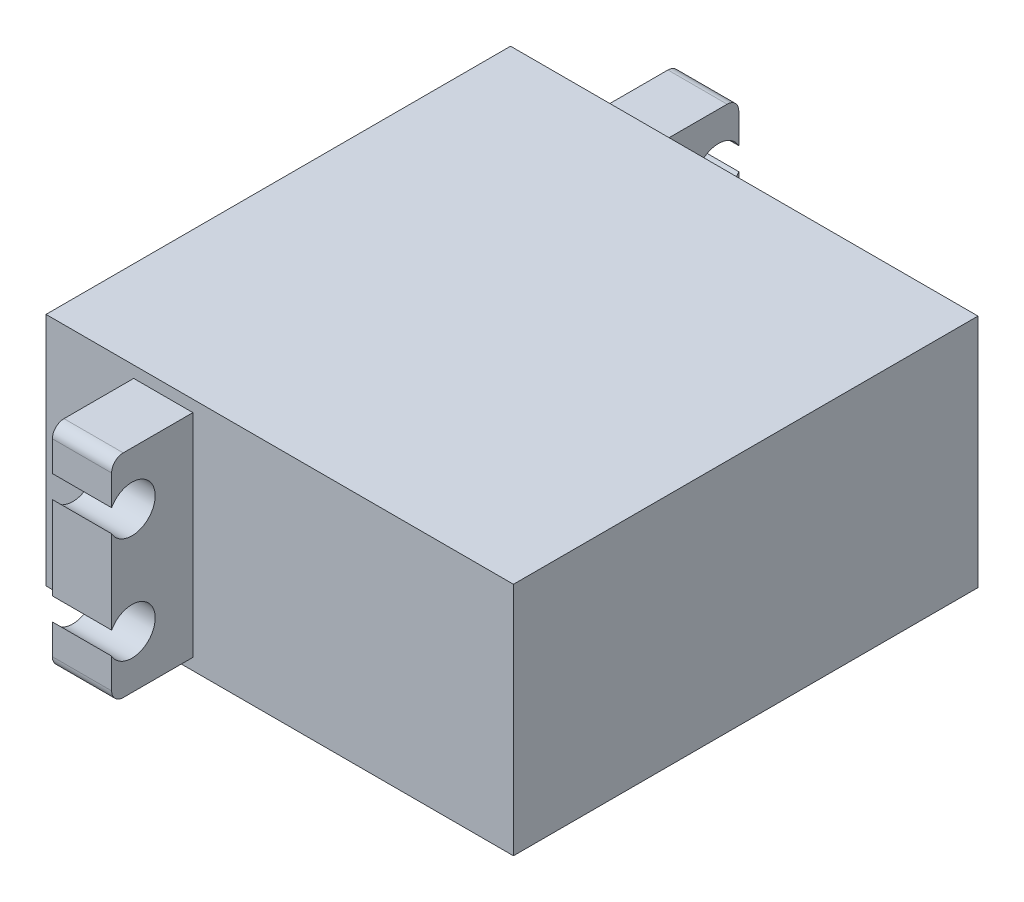
ISO-10303-21;
HEADER;
FILE_DESCRIPTION(('STEP AP214'),'2;1');
FILE_NAME('part.step','',(''),(''),'','','');
FILE_SCHEMA(('AUTOMOTIVE_DESIGN { 1 0 10303 214 1 1 1 1 }'));
ENDSEC;
DATA;
#1=APPLICATION_CONTEXT('core data for automotive mechanical design processes');
#2=APPLICATION_PROTOCOL_DEFINITION('international standard','automotive_design',2000,#1);
#3=PRODUCT_CONTEXT('',#1,'mechanical');
#4=PRODUCT('Part','Part','',(#3));
#5=PRODUCT_RELATED_PRODUCT_CATEGORY('part','',(#4));
#6=PRODUCT_DEFINITION_FORMATION('','',#4);
#7=PRODUCT_DEFINITION_CONTEXT('part definition',#1,'design');
#8=PRODUCT_DEFINITION('design','',#6,#7);
#9=PRODUCT_DEFINITION_SHAPE('','',#8);
#10=(LENGTH_UNIT() NAMED_UNIT(*) SI_UNIT(.MILLI.,.METRE.));
#11=(NAMED_UNIT(*) PLANE_ANGLE_UNIT() SI_UNIT($,.RADIAN.));
#12=(NAMED_UNIT(*) SI_UNIT($,.STERADIAN.) SOLID_ANGLE_UNIT());
#13=UNCERTAINTY_MEASURE_WITH_UNIT(LENGTH_MEASURE(1.E-05),#10,'distance_accuracy_value','');
#14=(GEOMETRIC_REPRESENTATION_CONTEXT(3) GLOBAL_UNCERTAINTY_ASSIGNED_CONTEXT((#13)) GLOBAL_UNIT_ASSIGNED_CONTEXT((#10,
#11,#12)) REPRESENTATION_CONTEXT('',''));
#15=CARTESIAN_POINT('',(0.,0.,0.));
#16=DIRECTION('',(0.,0.,1.));
#17=DIRECTION('',(1.,0.,0.));
#18=AXIS2_PLACEMENT_3D('',#15,#16,#17);
#19=CARTESIAN_POINT('',(0.,20.25,0.));
#20=DIRECTION('',(0.,0.,-1.));
#21=DIRECTION('',(-1.,0.,0.));
#22=AXIS2_PLACEMENT_3D('',#19,#20,#21);
#23=PLANE('',#22);
#24=DIRECTION('',(1.,0.,0.));
#25=VECTOR('',#24,1.);
#26=CARTESIAN_POINT('',(0.,0.,0.));
#27=LINE('',#26,#25);
#28=CARTESIAN_POINT('',(0.,0.,0.));
#29=VERTEX_POINT('',#28);
#30=CARTESIAN_POINT('',(40.25,0.,0.));
#31=VERTEX_POINT('',#30);
#32=EDGE_CURVE('E441',#29,#31,#27,.T.);
#33=ORIENTED_EDGE('',*,*,#32,.T.);
#34=DIRECTION('',(0.,-1.,0.));
#35=VECTOR('',#34,1.);
#36=CARTESIAN_POINT('',(40.25,20.25,0.));
#37=LINE('',#36,#35);
#38=CARTESIAN_POINT('',(40.25,20.25,0.));
#39=VERTEX_POINT('',#38);
#40=EDGE_CURVE('E456',#39,#31,#37,.T.);
#41=ORIENTED_EDGE('',*,*,#40,.F.);
#42=DIRECTION('',(1.,0.,0.));
#43=VECTOR('',#42,1.);
#44=CARTESIAN_POINT('',(0.,20.25,0.));
#45=LINE('',#44,#43);
#46=CARTESIAN_POINT('',(0.,20.25,0.));
#47=VERTEX_POINT('',#46);
#48=EDGE_CURVE('E427',#47,#39,#45,.T.);
#49=ORIENTED_EDGE('',*,*,#48,.F.);
#50=DIRECTION('',(0.,-1.,0.));
#51=VECTOR('',#50,1.);
#52=CARTESIAN_POINT('',(0.,20.25,0.));
#53=LINE('',#52,#51);
#54=EDGE_CURVE('E459',#47,#29,#53,.T.);
#55=ORIENTED_EDGE('',*,*,#54,.T.);
#56=EDGE_LOOP('',(#33,#41,#49,#55));
#57=FACE_BOUND('',#56,.T.);
#58=DIRECTION('',(0.,1.,0.));
#59=VECTOR('',#58,1.);
#60=CARTESIAN_POINT('',(7.55,19.25,0.));
#61=LINE('',#60,#59);
#62=CARTESIAN_POINT('',(7.55,1.,0.));
#63=VERTEX_POINT('',#62);
#64=CARTESIAN_POINT('',(7.55,19.25,0.));
#65=VERTEX_POINT('',#64);
#66=EDGE_CURVE('E237',#63,#65,#61,.T.);
#67=ORIENTED_EDGE('',*,*,#66,.T.);
#68=DIRECTION('',(1.,0.,0.));
#69=VECTOR('',#68,1.);
#70=CARTESIAN_POINT('',(7.55,19.25,0.));
#71=LINE('',#70,#69);
#72=CARTESIAN_POINT('',(12.65,19.25,0.));
#73=VERTEX_POINT('',#72);
#74=EDGE_CURVE('E277',#65,#73,#71,.T.);
#75=ORIENTED_EDGE('',*,*,#74,.T.);
#76=DIRECTION('',(0.,1.,0.));
#77=VECTOR('',#76,1.);
#78=CARTESIAN_POINT('',(12.65,19.25,0.));
#79=LINE('',#78,#77);
#80=CARTESIAN_POINT('',(12.65,1.,0.));
#81=VERTEX_POINT('',#80);
#82=EDGE_CURVE('E270',#81,#73,#79,.T.);
#83=ORIENTED_EDGE('',*,*,#82,.F.);
#84=DIRECTION('',(1.,0.,0.));
#85=VECTOR('',#84,1.);
#86=CARTESIAN_POINT('',(7.55,1.,0.));
#87=LINE('',#86,#85);
#88=EDGE_CURVE('E225',#63,#81,#87,.T.);
#89=ORIENTED_EDGE('',*,*,#88,.F.);
#90=EDGE_LOOP('',(#67,#75,#83,#89));
#91=FACE_BOUND('',#90,.T.);
#92=ADVANCED_FACE('F49',(#57,#91),#23,.F.);
#93=CARTESIAN_POINT('',(0.,20.25,-40.));
#94=DIRECTION('',(1.,0.,0.));
#95=DIRECTION('',(0.,0.,-1.));
#96=AXIS2_PLACEMENT_3D('',#93,#94,#95);
#97=PLANE('',#96);
#98=CARTESIAN_POINT('',(0.,10.125,-29.5));
#99=DIRECTION('',(1.,0.,0.));
#100=DIRECTION('',(0.,0.,-1.));
#101=AXIS2_PLACEMENT_3D('',#98,#99,#100);
#102=CIRCLE('',#101,6.5);
#103=CARTESIAN_POINT('',(0.,10.125,-36.));
#104=VERTEX_POINT('',#103);
#105=EDGE_CURVE('E53',#104,#104,#102,.F.);
#106=ORIENTED_EDGE('',*,*,#105,.F.);
#107=EDGE_LOOP('',(#106));
#108=FACE_BOUND('',#107,.T.);
#109=DIRECTION('',(0.,0.,1.));
#110=VECTOR('',#109,1.);
#111=CARTESIAN_POINT('',(0.,0.,-40.));
#112=LINE('',#111,#110);
#113=CARTESIAN_POINT('',(0.,0.,-40.));
#114=VERTEX_POINT('',#113);
#115=EDGE_CURVE('E422',#114,#29,#112,.T.);
#116=ORIENTED_EDGE('',*,*,#115,.T.);
#117=ORIENTED_EDGE('',*,*,#54,.F.);
#118=DIRECTION('',(0.,0.,1.));
#119=VECTOR('',#118,1.);
#120=CARTESIAN_POINT('',(0.,20.25,-40.));
#121=LINE('',#120,#119);
#122=CARTESIAN_POINT('',(0.,20.25,-40.));
#123=VERTEX_POINT('',#122);
#124=EDGE_CURVE('E423',#123,#47,#121,.T.);
#125=ORIENTED_EDGE('',*,*,#124,.F.);
#126=DIRECTION('',(0.,-1.,0.));
#127=VECTOR('',#126,1.);
#128=CARTESIAN_POINT('',(0.,20.25,-40.));
#129=LINE('',#128,#127);
#130=EDGE_CURVE('E437',#123,#114,#129,.T.);
#131=ORIENTED_EDGE('',*,*,#130,.T.);
#132=EDGE_LOOP('',(#116,#117,#125,#131));
#133=FACE_BOUND('',#132,.T.);
#134=ADVANCED_FACE('F51',(#108,#133),#97,.F.);
#135=CARTESIAN_POINT('',(40.25,20.25,0.));
#136=DIRECTION('',(-1.,0.,0.));
#137=DIRECTION('',(0.,0.,1.));
#138=AXIS2_PLACEMENT_3D('',#135,#136,#137);
#139=PLANE('',#138);
#140=DIRECTION('',(0.,0.,-1.));
#141=VECTOR('',#140,1.);
#142=CARTESIAN_POINT('',(40.25,0.,0.));
#143=LINE('',#142,#141);
#144=CARTESIAN_POINT('',(40.25,0.,-40.));
#145=VERTEX_POINT('',#144);
#146=EDGE_CURVE('E444',#31,#145,#143,.T.);
#147=ORIENTED_EDGE('',*,*,#146,.T.);
#148=DIRECTION('',(0.,-1.,0.));
#149=VECTOR('',#148,1.);
#150=CARTESIAN_POINT('',(40.25,20.25,-40.));
#151=LINE('',#150,#149);
#152=CARTESIAN_POINT('',(40.25,20.25,-40.));
#153=VERTEX_POINT('',#152);
#154=EDGE_CURVE('E452',#153,#145,#151,.T.);
#155=ORIENTED_EDGE('',*,*,#154,.F.);
#156=DIRECTION('',(0.,0.,-1.));
#157=VECTOR('',#156,1.);
#158=CARTESIAN_POINT('',(40.25,20.25,0.));
#159=LINE('',#158,#157);
#160=EDGE_CURVE('E431',#39,#153,#159,.T.);
#161=ORIENTED_EDGE('',*,*,#160,.F.);
#162=ORIENTED_EDGE('',*,*,#40,.T.);
#163=EDGE_LOOP('',(#147,#155,#161,#162));
#164=FACE_BOUND('',#163,.T.);
#165=ADVANCED_FACE('F472',(#164),#139,.F.);
#166=CARTESIAN_POINT('',(40.25,20.25,-40.));
#167=DIRECTION('',(0.,0.,1.));
#168=DIRECTION('',(1.,0.,0.));
#169=AXIS2_PLACEMENT_3D('',#166,#167,#168);
#170=PLANE('',#169);
#171=DIRECTION('',(1.,0.,0.));
#172=VECTOR('',#171,1.);
#173=CARTESIAN_POINT('',(7.55,19.25,-40.));
#174=LINE('',#173,#172);
#175=CARTESIAN_POINT('',(7.55,19.25,-40.));
#176=VERTEX_POINT('',#175);
#177=CARTESIAN_POINT('',(12.65,19.25,-40.));
#178=VERTEX_POINT('',#177);
#179=EDGE_CURVE('E74',#176,#178,#174,.T.);
#180=ORIENTED_EDGE('',*,*,#179,.F.);
#181=DIRECTION('',(0.,-1.,0.));
#182=VECTOR('',#181,1.);
#183=CARTESIAN_POINT('',(7.55,19.25,-40.));
#184=LINE('',#183,#182);
#185=CARTESIAN_POINT('',(7.55,1.,-40.));
#186=VERTEX_POINT('',#185);
#187=EDGE_CURVE('E307',#176,#186,#184,.T.);
#188=ORIENTED_EDGE('',*,*,#187,.T.);
#189=DIRECTION('',(1.,0.,0.));
#190=VECTOR('',#189,1.);
#191=CARTESIAN_POINT('',(7.55,1.,-40.));
#192=LINE('',#191,#190);
#193=CARTESIAN_POINT('',(12.65,1.,-40.));
#194=VERTEX_POINT('',#193);
#195=EDGE_CURVE('E347',#186,#194,#192,.T.);
#196=ORIENTED_EDGE('',*,*,#195,.T.);
#197=DIRECTION('',(0.,-1.,0.));
#198=VECTOR('',#197,1.);
#199=CARTESIAN_POINT('',(12.65,19.25,-40.));
#200=LINE('',#199,#198);
#201=EDGE_CURVE('E273',#178,#194,#200,.T.);
#202=ORIENTED_EDGE('',*,*,#201,.F.);
#203=EDGE_LOOP('',(#180,#188,#196,#202));
#204=FACE_BOUND('',#203,.T.);
#205=DIRECTION('',(-1.,0.,0.));
#206=VECTOR('',#205,1.);
#207=CARTESIAN_POINT('',(40.25,0.,-40.));
#208=LINE('',#207,#206);
#209=EDGE_CURVE('E428',#145,#114,#208,.T.);
#210=ORIENTED_EDGE('',*,*,#209,.T.);
#211=ORIENTED_EDGE('',*,*,#130,.F.);
#212=DIRECTION('',(-1.,0.,0.));
#213=VECTOR('',#212,1.);
#214=CARTESIAN_POINT('',(40.25,20.25,-40.));
#215=LINE('',#214,#213);
#216=EDGE_CURVE('E434',#153,#123,#215,.T.);
#217=ORIENTED_EDGE('',*,*,#216,.F.);
#218=ORIENTED_EDGE('',*,*,#154,.T.);
#219=EDGE_LOOP('',(#210,#211,#217,#218));
#220=FACE_BOUND('',#219,.T.);
#221=ADVANCED_FACE('F489',(#204,#220),#170,.F.);
#222=CARTESIAN_POINT('',(0.,20.25,0.));
#223=DIRECTION('',(0.,1.,0.));
#224=DIRECTION('',(0.,0.,1.));
#225=AXIS2_PLACEMENT_3D('',#222,#223,#224);
#226=PLANE('',#225);
#227=ORIENTED_EDGE('',*,*,#124,.T.);
#228=ORIENTED_EDGE('',*,*,#48,.T.);
#229=ORIENTED_EDGE('',*,*,#160,.T.);
#230=ORIENTED_EDGE('',*,*,#216,.T.);
#231=EDGE_LOOP('',(#227,#228,#229,#230));
#232=FACE_BOUND('',#231,.T.);
#233=ADVANCED_FACE('F487',(#232),#226,.T.);
#234=CARTESIAN_POINT('',(0.,0.,0.));
#235=DIRECTION('',(0.,1.,0.));
#236=DIRECTION('',(0.,0.,1.));
#237=AXIS2_PLACEMENT_3D('',#234,#235,#236);
#238=PLANE('',#237);
#239=ORIENTED_EDGE('',*,*,#115,.F.);
#240=ORIENTED_EDGE('',*,*,#209,.F.);
#241=ORIENTED_EDGE('',*,*,#146,.F.);
#242=ORIENTED_EDGE('',*,*,#32,.F.);
#243=EDGE_LOOP('',(#239,#240,#241,#242));
#244=FACE_BOUND('',#243,.T.);
#245=ADVANCED_FACE('F478',(#244),#238,.F.);
#246=CARTESIAN_POINT('',(-1.35,10.125,-29.5));
#247=DIRECTION('',(1.,0.,0.));
#248=DIRECTION('',(0.,0.,-1.));
#249=AXIS2_PLACEMENT_3D('',#246,#247,#248);
#250=CYLINDRICAL_SURFACE('',#249,6.5);
#251=CARTESIAN_POINT('',(-1.35,10.125,-29.5));
#252=DIRECTION('',(-1.,0.,0.));
#253=DIRECTION('',(0.,0.,1.));
#254=AXIS2_PLACEMENT_3D('',#251,#252,#253);
#255=CIRCLE('',#254,6.5);
#256=CARTESIAN_POINT('',(-1.35,10.125,-36.));
#257=VERTEX_POINT('',#256);
#258=EDGE_CURVE('E417',#257,#257,#255,.T.);
#259=CARTESIAN_POINT('',(-1.35,10.125,-36.));
#260=CARTESIAN_POINT('',(-1.3359375,10.125,-36.));
#261=CARTESIAN_POINT('',(-1.321875,10.125,-36.));
#262=CARTESIAN_POINT('',(-1.29375,10.125,-36.));
#263=CARTESIAN_POINT('',(-1.2796875,10.125,-36.));
#264=CARTESIAN_POINT('',(-1.2515625,10.125,-36.));
#265=CARTESIAN_POINT('',(-1.2375,10.125,-36.));
#266=CARTESIAN_POINT('',(-1.209375,10.125,-36.));
#267=CARTESIAN_POINT('',(-1.1953125,10.125,-36.));
#268=CARTESIAN_POINT('',(-1.1671875,10.125,-36.));
#269=CARTESIAN_POINT('',(-1.153125,10.125,-36.));
#270=CARTESIAN_POINT('',(-1.125,10.125,-36.));
#271=CARTESIAN_POINT('',(-1.1109375,10.125,-36.));
#272=CARTESIAN_POINT('',(-1.0828125,10.125,-36.));
#273=CARTESIAN_POINT('',(-1.06875,10.125,-36.));
#274=CARTESIAN_POINT('',(-1.040625,10.125,-36.));
#275=CARTESIAN_POINT('',(-1.0265625,10.125,-36.));
#276=CARTESIAN_POINT('',(-0.9984375,10.125,-36.));
#277=CARTESIAN_POINT('',(-0.984375,10.125,-36.));
#278=CARTESIAN_POINT('',(-0.95625,10.125,-36.));
#279=CARTESIAN_POINT('',(-0.9421875,10.125,-36.));
#280=CARTESIAN_POINT('',(-0.9140625,10.125,-36.));
#281=CARTESIAN_POINT('',(-0.9,10.125,-36.));
#282=CARTESIAN_POINT('',(-0.871875,10.125,-36.));
#283=CARTESIAN_POINT('',(-0.8578125,10.125,-36.));
#284=CARTESIAN_POINT('',(-0.8296875,10.125,-36.));
#285=CARTESIAN_POINT('',(-0.815625,10.125,-36.));
#286=CARTESIAN_POINT('',(-0.7875,10.125,-36.));
#287=CARTESIAN_POINT('',(-0.7734375,10.125,-36.));
#288=CARTESIAN_POINT('',(-0.7453125,10.125,-36.));
#289=CARTESIAN_POINT('',(-0.73125,10.125,-36.));
#290=CARTESIAN_POINT('',(-0.703125,10.125,-36.));
#291=CARTESIAN_POINT('',(-0.6890625,10.125,-36.));
#292=CARTESIAN_POINT('',(-0.6609375,10.125,-36.));
#293=CARTESIAN_POINT('',(-0.646875,10.125,-36.));
#294=CARTESIAN_POINT('',(-0.61875,10.125,-36.));
#295=CARTESIAN_POINT('',(-0.6046875,10.125,-36.));
#296=CARTESIAN_POINT('',(-0.5765625,10.125,-36.));
#297=CARTESIAN_POINT('',(-0.5625,10.125,-36.));
#298=CARTESIAN_POINT('',(-0.534375,10.125,-36.));
#299=CARTESIAN_POINT('',(-0.5203125,10.125,-36.));
#300=CARTESIAN_POINT('',(-0.4921875,10.125,-36.));
#301=CARTESIAN_POINT('',(-0.478125,10.125,-36.));
#302=CARTESIAN_POINT('',(-0.45,10.125,-36.));
#303=CARTESIAN_POINT('',(-0.4359375,10.125,-36.));
#304=CARTESIAN_POINT('',(-0.4078125,10.125,-36.));
#305=CARTESIAN_POINT('',(-0.39375,10.125,-36.));
#306=CARTESIAN_POINT('',(-0.365625,10.125,-36.));
#307=CARTESIAN_POINT('',(-0.3515625,10.125,-36.));
#308=CARTESIAN_POINT('',(-0.3234375,10.125,-36.));
#309=CARTESIAN_POINT('',(-0.309375,10.125,-36.));
#310=CARTESIAN_POINT('',(-0.28125,10.125,-36.));
#311=CARTESIAN_POINT('',(-0.2671875,10.125,-36.));
#312=CARTESIAN_POINT('',(-0.2390625,10.125,-36.));
#313=CARTESIAN_POINT('',(-0.225,10.125,-36.));
#314=CARTESIAN_POINT('',(-0.196875,10.125,-36.));
#315=CARTESIAN_POINT('',(-0.1828125,10.125,-36.));
#316=CARTESIAN_POINT('',(-0.1546875,10.125,-36.));
#317=CARTESIAN_POINT('',(-0.140625,10.125,-36.));
#318=CARTESIAN_POINT('',(-0.1125,10.125,-36.));
#319=CARTESIAN_POINT('',(-0.0984375000000002,10.125,-36.));
#320=CARTESIAN_POINT('',(-0.0703125000000002,10.125,-36.));
#321=CARTESIAN_POINT('',(-0.0562500000000002,10.125,-36.));
#322=CARTESIAN_POINT('',(-0.0281250000000002,10.125,-36.));
#323=CARTESIAN_POINT('',(-0.0140625000000002,10.125,-36.));
#324=CARTESIAN_POINT('',(0.,10.125,-36.));
#325=B_SPLINE_CURVE_WITH_KNOTS('',3,(#259,#260,#261,#262,#263,#264,#265,#266,#267,#268,#269,
#270,#271,#272,#273,#274,#275,#276,#277,#278,#279,#280,#281,#282,#283,#284,#285,#286,#287,#288,
#289,#290,#291,#292,#293,#294,#295,#296,#297,#298,#299,#300,#301,#302,#303,#304,#305,#306,#307,
#308,#309,#310,#311,#312,#313,#314,#315,#316,#317,#318,#319,#320,#321,#322,#323,#324),
.UNSPECIFIED.,.F.,.F.,(4,2,2,2,2,2,2,2,2,2,2,2,2,2,2,2,2,2,2,2,2,2,2,2,2,2,2,2,2,2,2,2,4),(0.,
0.0421874999999999,0.0843749999999998,0.1265625,0.16875,0.2109375,0.253125,0.2953125,0.3375,
0.3796875,0.421875,0.4640625,0.50625,0.5484375,0.590625,0.6328125,0.675,0.7171875,0.759375,
0.8015625,0.84375,0.8859375,0.928125,0.9703125,1.0125,1.0546875,1.096875,1.1390625,1.18125,
1.2234375,1.265625,1.3078125,1.35),.UNSPECIFIED.);
#326=EDGE_CURVE('BSEAM468',#257,#104,#325,.T.);
#327=ORIENTED_EDGE('',*,*,#258,.F.);
#328=ORIENTED_EDGE('',*,*,#105,.T.);
#329=ORIENTED_EDGE('',*,*,#326,.T.);
#330=ORIENTED_EDGE('',*,*,#326,.F.);
#331=EDGE_LOOP('',(#327,#329,#328,#330));
#332=FACE_BOUND('',#331,.T.);
#333=ADVANCED_FACE('F468',(#332),#250,.T.);
#334=CARTESIAN_POINT('',(-1.35,10.125,-29.5));
#335=DIRECTION('',(-1.,0.,0.));
#336=DIRECTION('',(0.,0.,1.));
#337=AXIS2_PLACEMENT_3D('',#334,#335,#336);
#338=PLANE('',#337);
#339=CARTESIAN_POINT('',(-1.35,10.125,-29.5));
#340=DIRECTION('',(-1.,0.,0.));
#341=DIRECTION('',(0.,0.,1.));
#342=AXIS2_PLACEMENT_3D('',#339,#340,#341);
#343=CIRCLE('',#342,3.);
#344=CARTESIAN_POINT('',(-1.35,10.125,-26.5));
#345=VERTEX_POINT('',#344);
#346=EDGE_CURVE('E11',#345,#345,#343,.T.);
#347=ORIENTED_EDGE('',*,*,#346,.F.);
#348=EDGE_LOOP('',(#347));
#349=FACE_BOUND('',#348,.T.);
#350=ORIENTED_EDGE('',*,*,#258,.T.);
#351=EDGE_LOOP('',(#350));
#352=FACE_BOUND('',#351,.T.);
#353=ADVANCED_FACE('F537',(#349,#352),#338,.T.);
#354=CARTESIAN_POINT('',(-5.6,10.125,-29.5));
#355=DIRECTION('',(1.,0.,0.));
#356=DIRECTION('',(0.,0.,-1.));
#357=AXIS2_PLACEMENT_3D('',#354,#355,#356);
#358=CYLINDRICAL_SURFACE('',#357,3.);
#359=CARTESIAN_POINT('',(-5.6,10.125,-29.5));
#360=DIRECTION('',(-1.,0.,0.));
#361=DIRECTION('',(0.,0.,1.));
#362=AXIS2_PLACEMENT_3D('',#359,#360,#361);
#363=CIRCLE('',#362,3.);
#364=CARTESIAN_POINT('',(-5.6,10.125,-26.5));
#365=VERTEX_POINT('',#364);
#366=EDGE_CURVE('E388',#365,#365,#363,.T.);
#367=ORIENTED_EDGE('',*,*,#366,.F.);
#368=EDGE_LOOP('',(#367));
#369=FACE_BOUND('',#368,.T.);
#370=ORIENTED_EDGE('',*,*,#346,.T.);
#371=EDGE_LOOP('',(#370));
#372=FACE_BOUND('',#371,.T.);
#373=ADVANCED_FACE('F547',(#369,#372),#358,.T.);
#374=CARTESIAN_POINT('',(-5.6,10.125,-29.5));
#375=DIRECTION('',(-1.,0.,0.));
#376=DIRECTION('',(0.,0.,1.));
#377=AXIS2_PLACEMENT_3D('',#374,#375,#376);
#378=PLANE('',#377);
#379=ORIENTED_EDGE('',*,*,#366,.T.);
#380=EDGE_LOOP('',(#379));
#381=FACE_BOUND('',#380,.T.);
#382=ADVANCED_FACE('F557',(#381),#378,.T.);
#383=CARTESIAN_POINT('',(7.55,19.25,-40.));
#384=DIRECTION('',(0.,1.,0.));
#385=DIRECTION('',(0.,0.,1.));
#386=AXIS2_PLACEMENT_3D('',#383,#384,#385);
#387=PLANE('',#386);
#388=DIRECTION('',(0.,0.,1.));
#389=VECTOR('',#388,1.);
#390=CARTESIAN_POINT('',(12.65,19.25,-40.));
#391=LINE('',#390,#389);
#392=CARTESIAN_POINT('',(12.65,19.25,-46.));
#393=VERTEX_POINT('',#392);
#394=EDGE_CURVE('E311',#393,#178,#391,.T.);
#395=ORIENTED_EDGE('',*,*,#394,.F.);
#396=DIRECTION('',(1.,0.,0.));
#397=VECTOR('',#396,1.);
#398=CARTESIAN_POINT('',(7.55,19.25,-46.));
#399=LINE('',#398,#397);
#400=CARTESIAN_POINT('',(7.55,19.25,-46.));
#401=VERTEX_POINT('',#400);
#402=EDGE_CURVE('E389',#401,#393,#399,.T.);
#403=ORIENTED_EDGE('',*,*,#402,.F.);
#404=DIRECTION('',(0.,0.,1.));
#405=VECTOR('',#404,1.);
#406=CARTESIAN_POINT('',(7.55,19.25,-40.));
#407=LINE('',#406,#405);
#408=EDGE_CURVE('E343',#401,#176,#407,.T.);
#409=ORIENTED_EDGE('',*,*,#408,.T.);
#410=ORIENTED_EDGE('',*,*,#179,.T.);
#411=EDGE_LOOP('',(#395,#403,#409,#410));
#412=FACE_BOUND('',#411,.T.);
#413=ADVANCED_FACE('F567',(#412),#387,.T.);
#414=CARTESIAN_POINT('',(7.55,18.25,-46.));
#415=DIRECTION('',(1.,0.,0.));
#416=DIRECTION('',(0.,0.,-1.));
#417=AXIS2_PLACEMENT_3D('',#414,#415,#416);
#418=CYLINDRICAL_SURFACE('',#417,1.);
#419=CARTESIAN_POINT('',(12.65,18.25,-46.));
#420=DIRECTION('',(1.,0.,0.));
#421=DIRECTION('',(0.,0.,1.));
#422=AXIS2_PLACEMENT_3D('',#419,#420,#421);
#423=CIRCLE('',#422,1.);
#424=CARTESIAN_POINT('',(12.65,18.25,-47.));
#425=VERTEX_POINT('',#424);
#426=EDGE_CURVE('E379',#425,#393,#423,.T.);
#427=ORIENTED_EDGE('',*,*,#426,.F.);
#428=DIRECTION('',(1.,0.,0.));
#429=VECTOR('',#428,1.);
#430=CARTESIAN_POINT('',(7.55,18.25,-47.));
#431=LINE('',#430,#429);
#432=CARTESIAN_POINT('',(7.55,18.25,-47.));
#433=VERTEX_POINT('',#432);
#434=EDGE_CURVE('E392',#433,#425,#431,.T.);
#435=ORIENTED_EDGE('',*,*,#434,.F.);
#436=CARTESIAN_POINT('',(7.55,18.25,-46.));
#437=DIRECTION('',(1.,0.,0.));
#438=DIRECTION('',(0.,0.,1.));
#439=AXIS2_PLACEMENT_3D('',#436,#437,#438);
#440=CIRCLE('',#439,1.);
#441=EDGE_CURVE('E339',#433,#401,#440,.T.);
#442=ORIENTED_EDGE('',*,*,#441,.T.);
#443=ORIENTED_EDGE('',*,*,#402,.T.);
#444=EDGE_LOOP('',(#427,#435,#442,#443));
#445=FACE_BOUND('',#444,.T.);
#446=ADVANCED_FACE('F576',(#445),#418,.T.);
#447=CARTESIAN_POINT('',(7.55,18.25,-47.));
#448=DIRECTION('',(0.,0.,-1.));
#449=DIRECTION('',(-1.,0.,0.));
#450=AXIS2_PLACEMENT_3D('',#447,#448,#449);
#451=PLANE('',#450);
#452=DIRECTION('',(0.,1.,0.));
#453=VECTOR('',#452,1.);
#454=CARTESIAN_POINT('',(12.65,18.25,-47.));
#455=LINE('',#454,#453);
#456=CARTESIAN_POINT('',(12.65,15.6557458365519,-47.));
#457=VERTEX_POINT('',#456);
#458=EDGE_CURVE('E375',#457,#425,#455,.T.);
#459=ORIENTED_EDGE('',*,*,#458,.F.);
#460=DIRECTION('',(1.,0.,0.));
#461=VECTOR('',#460,1.);
#462=CARTESIAN_POINT('',(7.55,15.6557458365519,-47.));
#463=LINE('',#462,#461);
#464=CARTESIAN_POINT('',(7.55,15.6557458365519,-47.));
#465=VERTEX_POINT('',#464);
#466=EDGE_CURVE('E395',#465,#457,#463,.T.);
#467=ORIENTED_EDGE('',*,*,#466,.F.);
#468=DIRECTION('',(0.,1.,0.));
#469=VECTOR('',#468,1.);
#470=CARTESIAN_POINT('',(7.55,18.25,-47.));
#471=LINE('',#470,#469);
#472=EDGE_CURVE('E335',#465,#433,#471,.T.);
#473=ORIENTED_EDGE('',*,*,#472,.T.);
#474=ORIENTED_EDGE('',*,*,#434,.T.);
#475=EDGE_LOOP('',(#459,#467,#473,#474));
#476=FACE_BOUND('',#475,.T.);
#477=ADVANCED_FACE('F586',(#476),#451,.T.);
#478=CARTESIAN_POINT('',(7.55,14.6875,-45.25));
#479=DIRECTION('',(1.,0.,0.));
#480=DIRECTION('',(0.,0.,-1.));
#481=AXIS2_PLACEMENT_3D('',#478,#479,#480);
#482=CYLINDRICAL_SURFACE('',#481,2.);
#483=CARTESIAN_POINT('',(12.65,14.6875,-45.25));
#484=DIRECTION('',(-1.,0.,0.));
#485=DIRECTION('',(0.,0.,-1.));
#486=AXIS2_PLACEMENT_3D('',#483,#484,#485);
#487=CIRCLE('',#486,2.);
#488=CARTESIAN_POINT('',(12.65,13.7192541634481,-47.));
#489=VERTEX_POINT('',#488);
#490=EDGE_CURVE('E371',#489,#457,#487,.T.);
#491=ORIENTED_EDGE('',*,*,#490,.F.);
#492=DIRECTION('',(1.,0.,0.));
#493=VECTOR('',#492,1.);
#494=CARTESIAN_POINT('',(7.55,13.7192541634481,-47.));
#495=LINE('',#494,#493);
#496=CARTESIAN_POINT('',(7.55,13.7192541634481,-47.));
#497=VERTEX_POINT('',#496);
#498=EDGE_CURVE('E398',#497,#489,#495,.T.);
#499=ORIENTED_EDGE('',*,*,#498,.F.);
#500=CARTESIAN_POINT('',(7.55,14.6875,-45.25));
#501=DIRECTION('',(-1.,0.,0.));
#502=DIRECTION('',(0.,0.,-1.));
#503=AXIS2_PLACEMENT_3D('',#500,#501,#502);
#504=CIRCLE('',#503,2.);
#505=EDGE_CURVE('E331',#497,#465,#504,.T.);
#506=ORIENTED_EDGE('',*,*,#505,.T.);
#507=ORIENTED_EDGE('',*,*,#466,.T.);
#508=EDGE_LOOP('',(#491,#499,#506,#507));
#509=FACE_BOUND('',#508,.T.);
#510=ADVANCED_FACE('F596',(#509),#482,.F.);
#511=CARTESIAN_POINT('',(7.55,13.7192541634481,-47.));
#512=DIRECTION('',(0.,0.,-1.));
#513=DIRECTION('',(-1.,0.,0.));
#514=AXIS2_PLACEMENT_3D('',#511,#512,#513);
#515=PLANE('',#514);
#516=DIRECTION('',(0.,1.,0.));
#517=VECTOR('',#516,1.);
#518=CARTESIAN_POINT('',(12.65,13.7192541634481,-47.));
#519=LINE('',#518,#517);
#520=CARTESIAN_POINT('',(12.65,6.53074583655185,-47.));
#521=VERTEX_POINT('',#520);
#522=EDGE_CURVE('E367',#521,#489,#519,.T.);
#523=ORIENTED_EDGE('',*,*,#522,.F.);
#524=DIRECTION('',(1.,0.,0.));
#525=VECTOR('',#524,1.);
#526=CARTESIAN_POINT('',(7.55,6.53074583655185,-47.));
#527=LINE('',#526,#525);
#528=CARTESIAN_POINT('',(7.55,6.53074583655185,-47.));
#529=VERTEX_POINT('',#528);
#530=EDGE_CURVE('E401',#529,#521,#527,.T.);
#531=ORIENTED_EDGE('',*,*,#530,.F.);
#532=DIRECTION('',(0.,1.,0.));
#533=VECTOR('',#532,1.);
#534=CARTESIAN_POINT('',(7.55,13.7192541634481,-47.));
#535=LINE('',#534,#533);
#536=EDGE_CURVE('E327',#529,#497,#535,.T.);
#537=ORIENTED_EDGE('',*,*,#536,.T.);
#538=ORIENTED_EDGE('',*,*,#498,.T.);
#539=EDGE_LOOP('',(#523,#531,#537,#538));
#540=FACE_BOUND('',#539,.T.);
#541=ADVANCED_FACE('F606',(#540),#515,.T.);
#542=CARTESIAN_POINT('',(7.55,5.5625,-45.25));
#543=DIRECTION('',(1.,0.,0.));
#544=DIRECTION('',(0.,0.,-1.));
#545=AXIS2_PLACEMENT_3D('',#542,#543,#544);
#546=CYLINDRICAL_SURFACE('',#545,2.);
#547=CARTESIAN_POINT('',(12.65,5.5625,-45.25));
#548=DIRECTION('',(-1.,0.,0.));
#549=DIRECTION('',(0.,0.,1.));
#550=AXIS2_PLACEMENT_3D('',#547,#548,#549);
#551=CIRCLE('',#550,2.);
#552=CARTESIAN_POINT('',(12.65,4.59425416344814,-47.));
#553=VERTEX_POINT('',#552);
#554=EDGE_CURVE('E363',#553,#521,#551,.T.);
#555=ORIENTED_EDGE('',*,*,#554,.F.);
#556=DIRECTION('',(1.,0.,0.));
#557=VECTOR('',#556,1.);
#558=CARTESIAN_POINT('',(7.55,4.59425416344814,-47.));
#559=LINE('',#558,#557);
#560=CARTESIAN_POINT('',(7.55,4.59425416344814,-47.));
#561=VERTEX_POINT('',#560);
#562=EDGE_CURVE('E404',#561,#553,#559,.T.);
#563=ORIENTED_EDGE('',*,*,#562,.F.);
#564=CARTESIAN_POINT('',(7.55,5.5625,-45.25));
#565=DIRECTION('',(-1.,0.,0.));
#566=DIRECTION('',(0.,0.,1.));
#567=AXIS2_PLACEMENT_3D('',#564,#565,#566);
#568=CIRCLE('',#567,2.);
#569=EDGE_CURVE('E323',#561,#529,#568,.T.);
#570=ORIENTED_EDGE('',*,*,#569,.T.);
#571=ORIENTED_EDGE('',*,*,#530,.T.);
#572=EDGE_LOOP('',(#555,#563,#570,#571));
#573=FACE_BOUND('',#572,.T.);
#574=ADVANCED_FACE('F616',(#573),#546,.F.);
#575=CARTESIAN_POINT('',(7.55,4.59425416344814,-47.));
#576=DIRECTION('',(0.,0.,-1.));
#577=DIRECTION('',(-1.,0.,0.));
#578=AXIS2_PLACEMENT_3D('',#575,#576,#577);
#579=PLANE('',#578);
#580=DIRECTION('',(0.,1.,0.));
#581=VECTOR('',#580,1.);
#582=CARTESIAN_POINT('',(12.65,4.59425416344814,-47.));
#583=LINE('',#582,#581);
#584=CARTESIAN_POINT('',(12.65,2.00000000000001,-47.));
#585=VERTEX_POINT('',#584);
#586=EDGE_CURVE('E359',#585,#553,#583,.T.);
#587=ORIENTED_EDGE('',*,*,#586,.F.);
#588=DIRECTION('',(1.,0.,0.));
#589=VECTOR('',#588,1.);
#590=CARTESIAN_POINT('',(7.55,2.00000000000001,-47.));
#591=LINE('',#590,#589);
#592=CARTESIAN_POINT('',(7.55,2.00000000000001,-47.));
#593=VERTEX_POINT('',#592);
#594=EDGE_CURVE('E407',#593,#585,#591,.T.);
#595=ORIENTED_EDGE('',*,*,#594,.F.);
#596=DIRECTION('',(0.,1.,0.));
#597=VECTOR('',#596,1.);
#598=CARTESIAN_POINT('',(7.55,4.59425416344814,-47.));
#599=LINE('',#598,#597);
#600=EDGE_CURVE('E319',#593,#561,#599,.T.);
#601=ORIENTED_EDGE('',*,*,#600,.T.);
#602=ORIENTED_EDGE('',*,*,#562,.T.);
#603=EDGE_LOOP('',(#587,#595,#601,#602));
#604=FACE_BOUND('',#603,.T.);
#605=ADVANCED_FACE('F626',(#604),#579,.T.);
#606=CARTESIAN_POINT('',(7.55,2.,-46.));
#607=DIRECTION('',(1.,0.,0.));
#608=DIRECTION('',(0.,0.,-1.));
#609=AXIS2_PLACEMENT_3D('',#606,#607,#608);
#610=CYLINDRICAL_SURFACE('',#609,1.);
#611=CARTESIAN_POINT('',(12.65,2.,-46.));
#612=DIRECTION('',(1.,0.,0.));
#613=DIRECTION('',(0.,0.,1.));
#614=AXIS2_PLACEMENT_3D('',#611,#612,#613);
#615=CIRCLE('',#614,1.);
#616=CARTESIAN_POINT('',(12.65,1.,-46.));
#617=VERTEX_POINT('',#616);
#618=EDGE_CURVE('E355',#617,#585,#615,.T.);
#619=ORIENTED_EDGE('',*,*,#618,.F.);
#620=DIRECTION('',(1.,0.,0.));
#621=VECTOR('',#620,1.);
#622=CARTESIAN_POINT('',(7.55,1.,-46.));
#623=LINE('',#622,#621);
#624=CARTESIAN_POINT('',(7.55,1.,-46.));
#625=VERTEX_POINT('',#624);
#626=EDGE_CURVE('E410',#625,#617,#623,.T.);
#627=ORIENTED_EDGE('',*,*,#626,.F.);
#628=CARTESIAN_POINT('',(7.55,2.,-46.));
#629=DIRECTION('',(1.,0.,0.));
#630=DIRECTION('',(0.,0.,1.));
#631=AXIS2_PLACEMENT_3D('',#628,#629,#630);
#632=CIRCLE('',#631,1.);
#633=EDGE_CURVE('E315',#625,#593,#632,.T.);
#634=ORIENTED_EDGE('',*,*,#633,.T.);
#635=ORIENTED_EDGE('',*,*,#594,.T.);
#636=EDGE_LOOP('',(#619,#627,#634,#635));
#637=FACE_BOUND('',#636,.T.);
#638=ADVANCED_FACE('F636',(#637),#610,.T.);
#639=CARTESIAN_POINT('',(7.55,1.,-46.));
#640=DIRECTION('',(0.,-1.,0.));
#641=DIRECTION('',(0.,0.,-1.));
#642=AXIS2_PLACEMENT_3D('',#639,#640,#641);
#643=PLANE('',#642);
#644=DIRECTION('',(0.,0.,-1.));
#645=VECTOR('',#644,1.);
#646=CARTESIAN_POINT('',(12.65,1.,-46.));
#647=LINE('',#646,#645);
#648=EDGE_CURVE('E351',#194,#617,#647,.T.);
#649=ORIENTED_EDGE('',*,*,#648,.F.);
#650=ORIENTED_EDGE('',*,*,#195,.F.);
#651=DIRECTION('',(0.,0.,-1.));
#652=VECTOR('',#651,1.);
#653=CARTESIAN_POINT('',(7.55,1.,-46.));
#654=LINE('',#653,#652);
#655=EDGE_CURVE('E310',#186,#625,#654,.T.);
#656=ORIENTED_EDGE('',*,*,#655,.T.);
#657=ORIENTED_EDGE('',*,*,#626,.T.);
#658=EDGE_LOOP('',(#649,#650,#656,#657));
#659=FACE_BOUND('',#658,.T.);
#660=ADVANCED_FACE('F646',(#659),#643,.T.);
#661=CARTESIAN_POINT('',(7.55,2.,-46.));
#662=DIRECTION('',(-1.,0.,0.));
#663=DIRECTION('',(0.,0.,1.));
#664=AXIS2_PLACEMENT_3D('',#661,#662,#663);
#665=PLANE('',#664);
#666=ORIENTED_EDGE('',*,*,#187,.F.);
#667=ORIENTED_EDGE('',*,*,#408,.F.);
#668=ORIENTED_EDGE('',*,*,#441,.F.);
#669=ORIENTED_EDGE('',*,*,#472,.F.);
#670=ORIENTED_EDGE('',*,*,#505,.F.);
#671=ORIENTED_EDGE('',*,*,#536,.F.);
#672=ORIENTED_EDGE('',*,*,#569,.F.);
#673=ORIENTED_EDGE('',*,*,#600,.F.);
#674=ORIENTED_EDGE('',*,*,#633,.F.);
#675=ORIENTED_EDGE('',*,*,#655,.F.);
#676=EDGE_LOOP('',(#666,#667,#668,#669,#670,#671,#672,#673,#674,#675));
#677=FACE_BOUND('',#676,.T.);
#678=ADVANCED_FACE('F656',(#677),#665,.T.);
#679=CARTESIAN_POINT('',(12.65,2.,-46.));
#680=DIRECTION('',(-1.,0.,0.));
#681=DIRECTION('',(0.,0.,1.));
#682=AXIS2_PLACEMENT_3D('',#679,#680,#681);
#683=PLANE('',#682);
#684=ORIENTED_EDGE('',*,*,#201,.T.);
#685=ORIENTED_EDGE('',*,*,#648,.T.);
#686=ORIENTED_EDGE('',*,*,#618,.T.);
#687=ORIENTED_EDGE('',*,*,#586,.T.);
#688=ORIENTED_EDGE('',*,*,#554,.T.);
#689=ORIENTED_EDGE('',*,*,#522,.T.);
#690=ORIENTED_EDGE('',*,*,#490,.T.);
#691=ORIENTED_EDGE('',*,*,#458,.T.);
#692=ORIENTED_EDGE('',*,*,#426,.T.);
#693=ORIENTED_EDGE('',*,*,#394,.T.);
#694=EDGE_LOOP('',(#684,#685,#686,#687,#688,#689,#690,#691,#692,#693));
#695=FACE_BOUND('',#694,.T.);
#696=ADVANCED_FACE('F666',(#695),#683,.F.);
#697=CARTESIAN_POINT('',(7.55,1.,5.99999999999999));
#698=DIRECTION('',(0.,-1.,0.));
#699=DIRECTION('',(0.,0.,-1.));
#700=AXIS2_PLACEMENT_3D('',#697,#698,#699);
#701=PLANE('',#700);
#702=DIRECTION('',(0.,0.,-1.));
#703=VECTOR('',#702,1.);
#704=CARTESIAN_POINT('',(12.65,1.,5.99999999999999));
#705=LINE('',#704,#703);
#706=CARTESIAN_POINT('',(12.65,1.,5.99999999999999));
#707=VERTEX_POINT('',#706);
#708=EDGE_CURVE('E66',#707,#81,#705,.T.);
#709=ORIENTED_EDGE('',*,*,#708,.F.);
#710=DIRECTION('',(1.,0.,0.));
#711=VECTOR('',#710,1.);
#712=CARTESIAN_POINT('',(7.55,1.,5.99999999999999));
#713=LINE('',#712,#711);
#714=CARTESIAN_POINT('',(7.55,1.,5.99999999999999));
#715=VERTEX_POINT('',#714);
#716=EDGE_CURVE('E214',#715,#707,#713,.T.);
#717=ORIENTED_EDGE('',*,*,#716,.F.);
#718=DIRECTION('',(0.,0.,-1.));
#719=VECTOR('',#718,1.);
#720=CARTESIAN_POINT('',(7.55,1.,5.99999999999999));
#721=LINE('',#720,#719);
#722=EDGE_CURVE('E274',#715,#63,#721,.T.);
#723=ORIENTED_EDGE('',*,*,#722,.T.);
#724=ORIENTED_EDGE('',*,*,#88,.T.);
#725=EDGE_LOOP('',(#709,#717,#723,#724));
#726=FACE_BOUND('',#725,.T.);
#727=ADVANCED_FACE('F233',(#726),#701,.T.);
#728=CARTESIAN_POINT('',(7.55,2.,6.));
#729=DIRECTION('',(1.,0.,0.));
#730=DIRECTION('',(0.,0.,-1.));
#731=AXIS2_PLACEMENT_3D('',#728,#729,#730);
#732=CYLINDRICAL_SURFACE('',#731,1.);
#733=CARTESIAN_POINT('',(12.65,2.,6.));
#734=DIRECTION('',(1.,0.,0.));
#735=DIRECTION('',(0.,0.,-1.));
#736=AXIS2_PLACEMENT_3D('',#733,#734,#735);
#737=CIRCLE('',#736,1.);
#738=CARTESIAN_POINT('',(12.65,2.00000000000001,7.));
#739=VERTEX_POINT('',#738);
#740=EDGE_CURVE('E216',#739,#707,#737,.T.);
#741=ORIENTED_EDGE('',*,*,#740,.F.);
#742=DIRECTION('',(1.,0.,0.));
#743=VECTOR('',#742,1.);
#744=CARTESIAN_POINT('',(7.55,2.00000000000001,7.));
#745=LINE('',#744,#743);
#746=CARTESIAN_POINT('',(7.55,2.00000000000001,7.));
#747=VERTEX_POINT('',#746);
#748=EDGE_CURVE('E224',#747,#739,#745,.T.);
#749=ORIENTED_EDGE('',*,*,#748,.F.);
#750=CARTESIAN_POINT('',(7.55,2.,6.));
#751=DIRECTION('',(1.,0.,0.));
#752=DIRECTION('',(0.,0.,-1.));
#753=AXIS2_PLACEMENT_3D('',#750,#751,#752);
#754=CIRCLE('',#753,1.);
#755=EDGE_CURVE('E219',#747,#715,#754,.T.);
#756=ORIENTED_EDGE('',*,*,#755,.T.);
#757=ORIENTED_EDGE('',*,*,#716,.T.);
#758=EDGE_LOOP('',(#741,#749,#756,#757));
#759=FACE_BOUND('',#758,.T.);
#760=ADVANCED_FACE('F215',(#759),#732,.T.);
#761=CARTESIAN_POINT('',(7.55,4.59425416344814,7.));
#762=DIRECTION('',(0.,0.,1.));
#763=DIRECTION('',(1.,0.,0.));
#764=AXIS2_PLACEMENT_3D('',#761,#762,#763);
#765=PLANE('',#764);
#766=DIRECTION('',(0.,-1.,0.));
#767=VECTOR('',#766,1.);
#768=CARTESIAN_POINT('',(12.65,4.59425416344814,7.));
#769=LINE('',#768,#767);
#770=CARTESIAN_POINT('',(12.65,4.59425416344814,7.));
#771=VERTEX_POINT('',#770);
#772=EDGE_CURVE('E230',#771,#739,#769,.T.);
#773=ORIENTED_EDGE('',*,*,#772,.F.);
#774=DIRECTION('',(1.,0.,0.));
#775=VECTOR('',#774,1.);
#776=CARTESIAN_POINT('',(7.55,4.59425416344814,7.));
#777=LINE('',#776,#775);
#778=CARTESIAN_POINT('',(7.55,4.59425416344814,7.));
#779=VERTEX_POINT('',#778);
#780=EDGE_CURVE('E922',#779,#771,#777,.T.);
#781=ORIENTED_EDGE('',*,*,#780,.F.);
#782=DIRECTION('',(0.,-1.,0.));
#783=VECTOR('',#782,1.);
#784=CARTESIAN_POINT('',(7.55,4.59425416344814,7.));
#785=LINE('',#784,#783);
#786=EDGE_CURVE('E280',#779,#747,#785,.T.);
#787=ORIENTED_EDGE('',*,*,#786,.T.);
#788=ORIENTED_EDGE('',*,*,#748,.T.);
#789=EDGE_LOOP('',(#773,#781,#787,#788));
#790=FACE_BOUND('',#789,.T.);
#791=ADVANCED_FACE('F693',(#790),#765,.T.);
#792=CARTESIAN_POINT('',(7.55,5.5625,5.25));
#793=DIRECTION('',(1.,0.,0.));
#794=DIRECTION('',(0.,0.,-1.));
#795=AXIS2_PLACEMENT_3D('',#792,#793,#794);
#796=CYLINDRICAL_SURFACE('',#795,2.);
#797=CARTESIAN_POINT('',(12.65,5.5625,5.25));
#798=DIRECTION('',(-1.,0.,0.));
#799=DIRECTION('',(0.,0.,-1.));
#800=AXIS2_PLACEMENT_3D('',#797,#798,#799);
#801=CIRCLE('',#800,2.);
#802=CARTESIAN_POINT('',(12.65,6.53074583655185,7.));
#803=VERTEX_POINT('',#802);
#804=EDGE_CURVE('E247',#803,#771,#801,.T.);
#805=ORIENTED_EDGE('',*,*,#804,.F.);
#806=DIRECTION('',(1.,0.,0.));
#807=VECTOR('',#806,1.);
#808=CARTESIAN_POINT('',(7.55,6.53074583655185,7.));
#809=LINE('',#808,#807);
#810=CARTESIAN_POINT('',(7.55,6.53074583655185,7.));
#811=VERTEX_POINT('',#810);
#812=EDGE_CURVE('E925',#811,#803,#809,.T.);
#813=ORIENTED_EDGE('',*,*,#812,.F.);
#814=CARTESIAN_POINT('',(7.55,5.5625,5.25));
#815=DIRECTION('',(-1.,0.,0.));
#816=DIRECTION('',(0.,0.,-1.));
#817=AXIS2_PLACEMENT_3D('',#814,#815,#816);
#818=CIRCLE('',#817,2.);
#819=EDGE_CURVE('E284',#811,#779,#818,.T.);
#820=ORIENTED_EDGE('',*,*,#819,.T.);
#821=ORIENTED_EDGE('',*,*,#780,.T.);
#822=EDGE_LOOP('',(#805,#813,#820,#821));
#823=FACE_BOUND('',#822,.T.);
#824=ADVANCED_FACE('F702',(#823),#796,.F.);
#825=CARTESIAN_POINT('',(7.55,13.7192541634481,7.));
#826=DIRECTION('',(0.,0.,1.));
#827=DIRECTION('',(1.,0.,0.));
#828=AXIS2_PLACEMENT_3D('',#825,#826,#827);
#829=PLANE('',#828);
#830=DIRECTION('',(0.,-1.,0.));
#831=VECTOR('',#830,1.);
#832=CARTESIAN_POINT('',(12.65,13.7192541634481,7.));
#833=LINE('',#832,#831);
#834=CARTESIAN_POINT('',(12.65,13.7192541634481,7.));
#835=VERTEX_POINT('',#834);
#836=EDGE_CURVE('E250',#835,#803,#833,.T.);
#837=ORIENTED_EDGE('',*,*,#836,.F.);
#838=DIRECTION('',(1.,0.,0.));
#839=VECTOR('',#838,1.);
#840=CARTESIAN_POINT('',(7.55,13.7192541634481,7.));
#841=LINE('',#840,#839);
#842=CARTESIAN_POINT('',(7.55,13.7192541634481,7.));
#843=VERTEX_POINT('',#842);
#844=EDGE_CURVE('E928',#843,#835,#841,.T.);
#845=ORIENTED_EDGE('',*,*,#844,.F.);
#846=DIRECTION('',(0.,-1.,0.));
#847=VECTOR('',#846,1.);
#848=CARTESIAN_POINT('',(7.55,13.7192541634481,7.));
#849=LINE('',#848,#847);
#850=EDGE_CURVE('E288',#843,#811,#849,.T.);
#851=ORIENTED_EDGE('',*,*,#850,.T.);
#852=ORIENTED_EDGE('',*,*,#812,.T.);
#853=EDGE_LOOP('',(#837,#845,#851,#852));
#854=FACE_BOUND('',#853,.T.);
#855=ADVANCED_FACE('F712',(#854),#829,.T.);
#856=CARTESIAN_POINT('',(7.55,14.6875,5.25));
#857=DIRECTION('',(1.,0.,0.));
#858=DIRECTION('',(0.,0.,-1.));
#859=AXIS2_PLACEMENT_3D('',#856,#857,#858);
#860=CYLINDRICAL_SURFACE('',#859,2.);
#861=CARTESIAN_POINT('',(12.65,14.6875,5.25));
#862=DIRECTION('',(-1.,0.,0.));
#863=DIRECTION('',(0.,0.,1.));
#864=AXIS2_PLACEMENT_3D('',#861,#862,#863);
#865=CIRCLE('',#864,2.);
#866=CARTESIAN_POINT('',(12.65,15.6557458365519,7.));
#867=VERTEX_POINT('',#866);
#868=EDGE_CURVE('E254',#867,#835,#865,.T.);
#869=ORIENTED_EDGE('',*,*,#868,.F.);
#870=DIRECTION('',(1.,0.,0.));
#871=VECTOR('',#870,1.);
#872=CARTESIAN_POINT('',(7.55,15.6557458365519,7.));
#873=LINE('',#872,#871);
#874=CARTESIAN_POINT('',(7.55,15.6557458365519,7.));
#875=VERTEX_POINT('',#874);
#876=EDGE_CURVE('E931',#875,#867,#873,.T.);
#877=ORIENTED_EDGE('',*,*,#876,.F.);
#878=CARTESIAN_POINT('',(7.55,14.6875,5.25));
#879=DIRECTION('',(-1.,0.,0.));
#880=DIRECTION('',(0.,0.,1.));
#881=AXIS2_PLACEMENT_3D('',#878,#879,#880);
#882=CIRCLE('',#881,2.);
#883=EDGE_CURVE('E292',#875,#843,#882,.T.);
#884=ORIENTED_EDGE('',*,*,#883,.T.);
#885=ORIENTED_EDGE('',*,*,#844,.T.);
#886=EDGE_LOOP('',(#869,#877,#884,#885));
#887=FACE_BOUND('',#886,.T.);
#888=ADVANCED_FACE('F722',(#887),#860,.F.);
#889=CARTESIAN_POINT('',(7.55,18.25,7.));
#890=DIRECTION('',(0.,0.,1.));
#891=DIRECTION('',(1.,0.,0.));
#892=AXIS2_PLACEMENT_3D('',#889,#890,#891);
#893=PLANE('',#892);
#894=DIRECTION('',(0.,-1.,0.));
#895=VECTOR('',#894,1.);
#896=CARTESIAN_POINT('',(12.65,18.25,7.));
#897=LINE('',#896,#895);
#898=CARTESIAN_POINT('',(12.65,18.25,7.));
#899=VERTEX_POINT('',#898);
#900=EDGE_CURVE('E258',#899,#867,#897,.T.);
#901=ORIENTED_EDGE('',*,*,#900,.F.);
#902=DIRECTION('',(1.,0.,0.));
#903=VECTOR('',#902,1.);
#904=CARTESIAN_POINT('',(7.55,18.25,7.));
#905=LINE('',#904,#903);
#906=CARTESIAN_POINT('',(7.55,18.25,7.));
#907=VERTEX_POINT('',#906);
#908=EDGE_CURVE('E934',#907,#899,#905,.T.);
#909=ORIENTED_EDGE('',*,*,#908,.F.);
#910=DIRECTION('',(0.,-1.,0.));
#911=VECTOR('',#910,1.);
#912=CARTESIAN_POINT('',(7.55,18.25,7.));
#913=LINE('',#912,#911);
#914=EDGE_CURVE('E296',#907,#875,#913,.T.);
#915=ORIENTED_EDGE('',*,*,#914,.T.);
#916=ORIENTED_EDGE('',*,*,#876,.T.);
#917=EDGE_LOOP('',(#901,#909,#915,#916));
#918=FACE_BOUND('',#917,.T.);
#919=ADVANCED_FACE('F732',(#918),#893,.T.);
#920=CARTESIAN_POINT('',(7.55,18.25,6.));
#921=DIRECTION('',(1.,0.,0.));
#922=DIRECTION('',(0.,0.,-1.));
#923=AXIS2_PLACEMENT_3D('',#920,#921,#922);
#924=CYLINDRICAL_SURFACE('',#923,1.);
#925=CARTESIAN_POINT('',(12.65,18.25,6.));
#926=DIRECTION('',(1.,0.,0.));
#927=DIRECTION('',(0.,0.,-1.));
#928=AXIS2_PLACEMENT_3D('',#925,#926,#927);
#929=CIRCLE('',#928,1.);
#930=CARTESIAN_POINT('',(12.65,19.25,5.99999999999999));
#931=VERTEX_POINT('',#930);
#932=EDGE_CURVE('E262',#931,#899,#929,.T.);
#933=ORIENTED_EDGE('',*,*,#932,.F.);
#934=DIRECTION('',(1.,0.,0.));
#935=VECTOR('',#934,1.);
#936=CARTESIAN_POINT('',(7.55,19.25,5.99999999999999));
#937=LINE('',#936,#935);
#938=CARTESIAN_POINT('',(7.55,19.25,5.99999999999999));
#939=VERTEX_POINT('',#938);
#940=EDGE_CURVE('E937',#939,#931,#937,.T.);
#941=ORIENTED_EDGE('',*,*,#940,.F.);
#942=CARTESIAN_POINT('',(7.55,18.25,6.));
#943=DIRECTION('',(1.,0.,0.));
#944=DIRECTION('',(0.,0.,-1.));
#945=AXIS2_PLACEMENT_3D('',#942,#943,#944);
#946=CIRCLE('',#945,1.);
#947=EDGE_CURVE('E300',#939,#907,#946,.T.);
#948=ORIENTED_EDGE('',*,*,#947,.T.);
#949=ORIENTED_EDGE('',*,*,#908,.T.);
#950=EDGE_LOOP('',(#933,#941,#948,#949));
#951=FACE_BOUND('',#950,.T.);
#952=ADVANCED_FACE('F742',(#951),#924,.T.);
#953=CARTESIAN_POINT('',(7.55,19.25,0.));
#954=DIRECTION('',(0.,1.,0.));
#955=DIRECTION('',(0.,0.,1.));
#956=AXIS2_PLACEMENT_3D('',#953,#954,#955);
#957=PLANE('',#956);
#958=DIRECTION('',(0.,0.,1.));
#959=VECTOR('',#958,1.);
#960=CARTESIAN_POINT('',(12.65,19.25,0.));
#961=LINE('',#960,#959);
#962=EDGE_CURVE('E266',#73,#931,#961,.T.);
#963=ORIENTED_EDGE('',*,*,#962,.F.);
#964=ORIENTED_EDGE('',*,*,#74,.F.);
#965=DIRECTION('',(0.,0.,1.));
#966=VECTOR('',#965,1.);
#967=CARTESIAN_POINT('',(7.55,19.25,0.));
#968=LINE('',#967,#966);
#969=EDGE_CURVE('E241',#65,#939,#968,.T.);
#970=ORIENTED_EDGE('',*,*,#969,.T.);
#971=ORIENTED_EDGE('',*,*,#940,.T.);
#972=EDGE_LOOP('',(#963,#964,#970,#971));
#973=FACE_BOUND('',#972,.T.);
#974=ADVANCED_FACE('F752',(#973),#957,.T.);
#975=CARTESIAN_POINT('',(7.55,2.,6.));
#976=DIRECTION('',(1.,0.,0.));
#977=DIRECTION('',(0.,0.,-1.));
#978=AXIS2_PLACEMENT_3D('',#975,#976,#977);
#979=PLANE('',#978);
#980=ORIENTED_EDGE('',*,*,#66,.F.);
#981=ORIENTED_EDGE('',*,*,#722,.F.);
#982=ORIENTED_EDGE('',*,*,#755,.F.);
#983=ORIENTED_EDGE('',*,*,#786,.F.);
#984=ORIENTED_EDGE('',*,*,#819,.F.);
#985=ORIENTED_EDGE('',*,*,#850,.F.);
#986=ORIENTED_EDGE('',*,*,#883,.F.);
#987=ORIENTED_EDGE('',*,*,#914,.F.);
#988=ORIENTED_EDGE('',*,*,#947,.F.);
#989=ORIENTED_EDGE('',*,*,#969,.F.);
#990=EDGE_LOOP('',(#980,#981,#982,#983,#984,#985,#986,#987,#988,#989));
#991=FACE_BOUND('',#990,.T.);
#992=ADVANCED_FACE('F762',(#991),#979,.F.);
#993=CARTESIAN_POINT('',(12.65,2.,6.));
#994=DIRECTION('',(1.,0.,0.));
#995=DIRECTION('',(0.,0.,-1.));
#996=AXIS2_PLACEMENT_3D('',#993,#994,#995);
#997=PLANE('',#996);
#998=ORIENTED_EDGE('',*,*,#82,.T.);
#999=ORIENTED_EDGE('',*,*,#962,.T.);
#1000=ORIENTED_EDGE('',*,*,#932,.T.);
#1001=ORIENTED_EDGE('',*,*,#900,.T.);
#1002=ORIENTED_EDGE('',*,*,#868,.T.);
#1003=ORIENTED_EDGE('',*,*,#836,.T.);
#1004=ORIENTED_EDGE('',*,*,#804,.T.);
#1005=ORIENTED_EDGE('',*,*,#772,.T.);
#1006=ORIENTED_EDGE('',*,*,#740,.T.);
#1007=ORIENTED_EDGE('',*,*,#708,.T.);
#1008=EDGE_LOOP('',(#998,#999,#1000,#1001,#1002,#1003,#1004,#1005,#1006,#1007));
#1009=FACE_BOUND('',#1008,.T.);
#1010=ADVANCED_FACE('F227',(#1009),#997,.T.);
#1011=CLOSED_SHELL('',(#92,#134,#165,#221,#233,#245,#333,#353,#373,#382,#413,#446,#477,#510,
#541,#574,#605,#638,#660,#678,#696,#727,#760,#791,#824,#855,#888,#919,#952,#974,#992,#1010));
#1012=MANIFOLD_SOLID_BREP('B2',#1011);
#1013=ADVANCED_BREP_SHAPE_REPRESENTATION('',(#18,#1012),#14);
#1014=SHAPE_DEFINITION_REPRESENTATION(#9,#1013);
ENDSEC;
END-ISO-10303-21;
